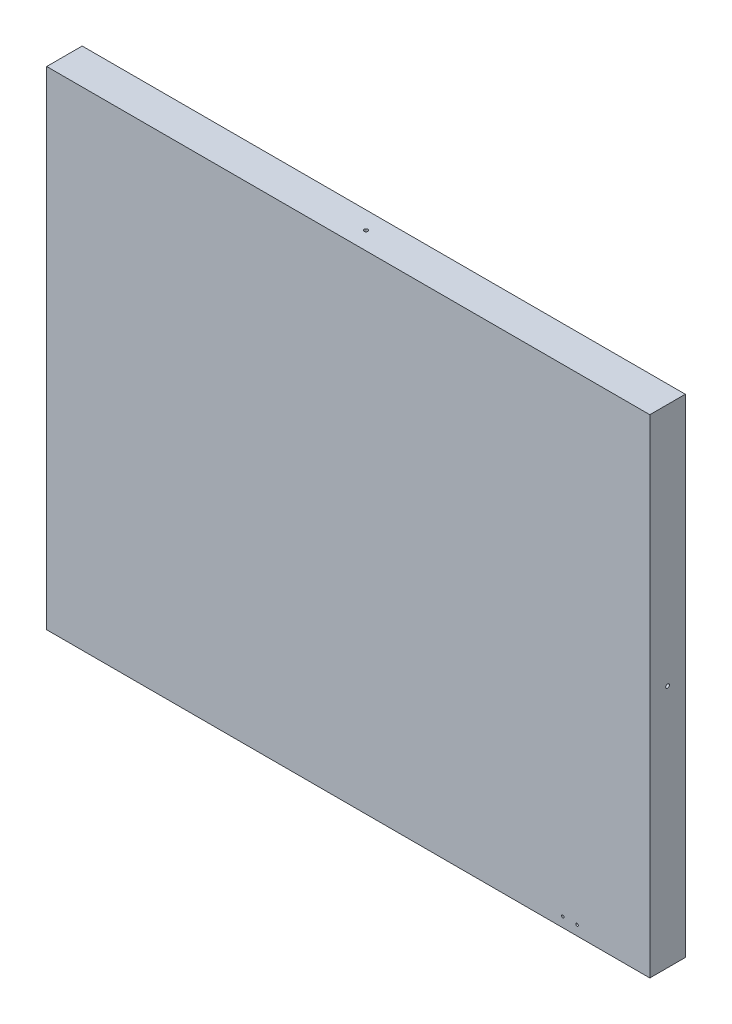
ISO-10303-21;
HEADER;
FILE_DESCRIPTION(('STEP AP214'),'2;1');
FILE_NAME('part.step','',(''),(''),'','','');
FILE_SCHEMA(('AUTOMOTIVE_DESIGN { 1 0 10303 214 1 1 1 1 }'));
ENDSEC;
DATA;
#1=APPLICATION_CONTEXT('core data for automotive mechanical design processes');
#2=APPLICATION_PROTOCOL_DEFINITION('international standard','automotive_design',2000,#1);
#3=PRODUCT_CONTEXT('',#1,'mechanical');
#4=PRODUCT('Part','Part','',(#3));
#5=PRODUCT_RELATED_PRODUCT_CATEGORY('part','',(#4));
#6=PRODUCT_DEFINITION_FORMATION('','',#4);
#7=PRODUCT_DEFINITION_CONTEXT('part definition',#1,'design');
#8=PRODUCT_DEFINITION('design','',#6,#7);
#9=PRODUCT_DEFINITION_SHAPE('','',#8);
#10=(LENGTH_UNIT() NAMED_UNIT(*) SI_UNIT(.MILLI.,.METRE.));
#11=(NAMED_UNIT(*) PLANE_ANGLE_UNIT() SI_UNIT($,.RADIAN.));
#12=(NAMED_UNIT(*) SI_UNIT($,.STERADIAN.) SOLID_ANGLE_UNIT());
#13=UNCERTAINTY_MEASURE_WITH_UNIT(LENGTH_MEASURE(1.E-05),#10,'distance_accuracy_value','');
#14=(GEOMETRIC_REPRESENTATION_CONTEXT(3) GLOBAL_UNCERTAINTY_ASSIGNED_CONTEXT((#13)) GLOBAL_UNIT_ASSIGNED_CONTEXT((#10,
#11,#12)) REPRESENTATION_CONTEXT('',''));
#15=CARTESIAN_POINT('',(0.,0.,0.));
#16=DIRECTION('',(0.,0.,1.));
#17=DIRECTION('',(1.,0.,0.));
#18=AXIS2_PLACEMENT_3D('',#15,#16,#17);
#19=CARTESIAN_POINT('',(0.,-275.,20.));
#20=DIRECTION('',(0.,-1.,0.));
#21=DIRECTION('',(0.,0.,-1.));
#22=AXIS2_PLACEMENT_3D('',#19,#20,#21);
#23=CYLINDRICAL_SURFACE('',#22,2.09999999999996);
#24=CARTESIAN_POINT('',(0.,-275.,20.));
#25=DIRECTION('',(0.,-1.,0.));
#26=DIRECTION('',(0.,0.,-1.));
#27=AXIS2_PLACEMENT_3D('',#24,#25,#26);
#28=CIRCLE('',#27,2.09999999999999);
#29=CARTESIAN_POINT('',(0.,-275.,17.9));
#30=VERTEX_POINT('',#29);
#31=EDGE_CURVE('E144',#30,#30,#28,.T.);
#32=ORIENTED_EDGE('',*,*,#31,.T.);
#33=EDGE_LOOP('',(#32));
#34=FACE_BOUND('',#33,.T.);
#35=CARTESIAN_POINT('',(0.,0.,20.));
#36=DIRECTION('',(0.707106781186547,-0.707106781186547,0.));
#37=DIRECTION('',(-0.707106781186547,-0.707106781186547,0.));
#38=AXIS2_PLACEMENT_3D('',#35,#36,#37);
#39=ELLIPSE('',#38,2.96984848098344,2.09999999999996);
#40=CARTESIAN_POINT('',(0.,0.,17.9));
#41=VERTEX_POINT('',#40);
#42=CARTESIAN_POINT('',(0.,0.,22.1));
#43=VERTEX_POINT('',#42);
#44=EDGE_CURVE('E69',#41,#43,#39,.F.);
#45=ORIENTED_EDGE('',*,*,#44,.T.);
#46=CARTESIAN_POINT('',(0.,0.,20.));
#47=DIRECTION('',(-0.707106781186547,-0.707106781186547,0.));
#48=DIRECTION('',(0.707106781186547,-0.707106781186547,0.));
#49=AXIS2_PLACEMENT_3D('',#46,#47,#48);
#50=ELLIPSE('',#49,2.96984848098344,2.09999999999996);
#51=EDGE_CURVE('E13',#43,#41,#50,.F.);
#52=ORIENTED_EDGE('',*,*,#51,.T.);
#53=EDGE_LOOP('',(#45,#52));
#54=FACE_BOUND('',#53,.T.);
#55=ADVANCED_FACE('F56',(#34,#54),#23,.F.);
#56=CARTESIAN_POINT('',(340.,275.,40.));
#57=DIRECTION('',(-1.,0.,0.));
#58=DIRECTION('',(0.,-1.,0.));
#59=AXIS2_PLACEMENT_3D('',#56,#57,#58);
#60=PLANE('',#59);
#61=CARTESIAN_POINT('',(340.,0.,20.));
#62=DIRECTION('',(-1.,0.,0.));
#63=DIRECTION('',(0.,0.,1.));
#64=AXIS2_PLACEMENT_3D('',#61,#62,#63);
#65=CIRCLE('',#64,2.09999999999992);
#66=CARTESIAN_POINT('',(340.,0.,22.0999999999999));
#67=VERTEX_POINT('',#66);
#68=EDGE_CURVE('E141',#67,#67,#65,.T.);
#69=ORIENTED_EDGE('',*,*,#68,.T.);
#70=EDGE_LOOP('',(#69));
#71=FACE_BOUND('',#70,.T.);
#72=DIRECTION('',(0.,1.,0.));
#73=VECTOR('',#72,1.);
#74=CARTESIAN_POINT('',(340.,275.,0.));
#75=LINE('',#74,#73);
#76=CARTESIAN_POINT('',(340.,-275.,0.));
#77=VERTEX_POINT('',#76);
#78=CARTESIAN_POINT('',(340.,275.,0.));
#79=VERTEX_POINT('',#78);
#80=EDGE_CURVE('E150',#77,#79,#75,.T.);
#81=ORIENTED_EDGE('',*,*,#80,.T.);
#82=DIRECTION('',(0.,0.,-1.));
#83=VECTOR('',#82,1.);
#84=CARTESIAN_POINT('',(340.,275.,40.));
#85=LINE('',#84,#83);
#86=CARTESIAN_POINT('',(340.,275.,40.));
#87=VERTEX_POINT('',#86);
#88=EDGE_CURVE('E171',#87,#79,#85,.T.);
#89=ORIENTED_EDGE('',*,*,#88,.F.);
#90=DIRECTION('',(0.,1.,0.));
#91=VECTOR('',#90,1.);
#92=CARTESIAN_POINT('',(340.,275.,40.));
#93=LINE('',#92,#91);
#94=CARTESIAN_POINT('',(340.,-275.,40.));
#95=VERTEX_POINT('',#94);
#96=EDGE_CURVE('E151',#95,#87,#93,.T.);
#97=ORIENTED_EDGE('',*,*,#96,.F.);
#98=DIRECTION('',(0.,0.,-1.));
#99=VECTOR('',#98,1.);
#100=CARTESIAN_POINT('',(340.,-275.,40.));
#101=LINE('',#100,#99);
#102=EDGE_CURVE('E157',#95,#77,#101,.T.);
#103=ORIENTED_EDGE('',*,*,#102,.T.);
#104=EDGE_LOOP('',(#81,#89,#97,#103));
#105=FACE_BOUND('',#104,.T.);
#106=ADVANCED_FACE('F58',(#71,#105),#60,.F.);
#107=CARTESIAN_POINT('',(-340.,275.,40.));
#108=DIRECTION('',(0.,-1.,0.));
#109=DIRECTION('',(0.,0.,-1.));
#110=AXIS2_PLACEMENT_3D('',#107,#108,#109);
#111=PLANE('',#110);
#112=CARTESIAN_POINT('',(0.,275.,20.));
#113=DIRECTION('',(0.,-1.,0.));
#114=DIRECTION('',(0.,0.,-1.));
#115=AXIS2_PLACEMENT_3D('',#112,#113,#114);
#116=CIRCLE('',#115,2.09999999999993);
#117=CARTESIAN_POINT('',(0.,275.,17.9000000000001));
#118=VERTEX_POINT('',#117);
#119=EDGE_CURVE('E147',#118,#118,#116,.T.);
#120=ORIENTED_EDGE('',*,*,#119,.T.);
#121=EDGE_LOOP('',(#120));
#122=FACE_BOUND('',#121,.T.);
#123=DIRECTION('',(-1.,0.,0.));
#124=VECTOR('',#123,1.);
#125=CARTESIAN_POINT('',(-340.,275.,0.));
#126=LINE('',#125,#124);
#127=CARTESIAN_POINT('',(-340.,275.,0.));
#128=VERTEX_POINT('',#127);
#129=EDGE_CURVE('E160',#79,#128,#126,.T.);
#130=ORIENTED_EDGE('',*,*,#129,.T.);
#131=DIRECTION('',(0.,0.,-1.));
#132=VECTOR('',#131,1.);
#133=CARTESIAN_POINT('',(-340.,275.,40.));
#134=LINE('',#133,#132);
#135=CARTESIAN_POINT('',(-340.,275.,40.));
#136=VERTEX_POINT('',#135);
#137=EDGE_CURVE('E168',#136,#128,#134,.T.);
#138=ORIENTED_EDGE('',*,*,#137,.F.);
#139=DIRECTION('',(-1.,0.,0.));
#140=VECTOR('',#139,1.);
#141=CARTESIAN_POINT('',(-340.,275.,40.));
#142=LINE('',#141,#140);
#143=EDGE_CURVE('E107',#87,#136,#142,.T.);
#144=ORIENTED_EDGE('',*,*,#143,.F.);
#145=ORIENTED_EDGE('',*,*,#88,.T.);
#146=EDGE_LOOP('',(#130,#138,#144,#145));
#147=FACE_BOUND('',#146,.T.);
#148=ADVANCED_FACE('F191',(#122,#147),#111,.F.);
#149=CARTESIAN_POINT('',(-340.,275.,40.));
#150=DIRECTION('',(1.,0.,0.));
#151=DIRECTION('',(0.,1.,0.));
#152=AXIS2_PLACEMENT_3D('',#149,#150,#151);
#153=PLANE('',#152);
#154=CARTESIAN_POINT('',(-340.,0.,20.));
#155=DIRECTION('',(-1.,0.,0.));
#156=DIRECTION('',(0.,0.,1.));
#157=AXIS2_PLACEMENT_3D('',#154,#155,#156);
#158=CIRCLE('',#157,2.09999999999999);
#159=CARTESIAN_POINT('',(-340.,0.,22.1));
#160=VERTEX_POINT('',#159);
#161=EDGE_CURVE('E138',#160,#160,#158,.T.);
#162=ORIENTED_EDGE('',*,*,#161,.F.);
#163=EDGE_LOOP('',(#162));
#164=FACE_BOUND('',#163,.T.);
#165=DIRECTION('',(0.,-1.,0.));
#166=VECTOR('',#165,1.);
#167=CARTESIAN_POINT('',(-340.,275.,0.));
#168=LINE('',#167,#166);
#169=CARTESIAN_POINT('',(-340.,-275.,0.));
#170=VERTEX_POINT('',#169);
#171=EDGE_CURVE('E162',#128,#170,#168,.T.);
#172=ORIENTED_EDGE('',*,*,#171,.T.);
#173=DIRECTION('',(0.,0.,-1.));
#174=VECTOR('',#173,1.);
#175=CARTESIAN_POINT('',(-340.,-275.,40.));
#176=LINE('',#175,#174);
#177=CARTESIAN_POINT('',(-340.,-275.,40.));
#178=VERTEX_POINT('',#177);
#179=EDGE_CURVE('E166',#178,#170,#176,.T.);
#180=ORIENTED_EDGE('',*,*,#179,.F.);
#181=DIRECTION('',(0.,-1.,0.));
#182=VECTOR('',#181,1.);
#183=CARTESIAN_POINT('',(-340.,275.,40.));
#184=LINE('',#183,#182);
#185=EDGE_CURVE('E154',#136,#178,#184,.T.);
#186=ORIENTED_EDGE('',*,*,#185,.F.);
#187=ORIENTED_EDGE('',*,*,#137,.T.);
#188=EDGE_LOOP('',(#172,#180,#186,#187));
#189=FACE_BOUND('',#188,.T.);
#190=ADVANCED_FACE('F214',(#164,#189),#153,.F.);
#191=CARTESIAN_POINT('',(-340.,-275.,40.));
#192=DIRECTION('',(0.,1.,0.));
#193=DIRECTION('',(0.,0.,1.));
#194=AXIS2_PLACEMENT_3D('',#191,#192,#193);
#195=PLANE('',#194);
#196=ORIENTED_EDGE('',*,*,#31,.F.);
#197=EDGE_LOOP('',(#196));
#198=FACE_BOUND('',#197,.T.);
#199=DIRECTION('',(1.,0.,0.));
#200=VECTOR('',#199,1.);
#201=CARTESIAN_POINT('',(-340.,-275.,0.));
#202=LINE('',#201,#200);
#203=EDGE_CURVE('E99',#170,#77,#202,.T.);
#204=ORIENTED_EDGE('',*,*,#203,.T.);
#205=ORIENTED_EDGE('',*,*,#102,.F.);
#206=DIRECTION('',(1.,0.,0.));
#207=VECTOR('',#206,1.);
#208=CARTESIAN_POINT('',(-340.,-275.,40.));
#209=LINE('',#208,#207);
#210=EDGE_CURVE('E78',#178,#95,#209,.T.);
#211=ORIENTED_EDGE('',*,*,#210,.F.);
#212=ORIENTED_EDGE('',*,*,#179,.T.);
#213=EDGE_LOOP('',(#204,#205,#211,#212));
#214=FACE_BOUND('',#213,.T.);
#215=ADVANCED_FACE('F208',(#198,#214),#195,.F.);
#216=CARTESIAN_POINT('',(0.,0.,40.));
#217=DIRECTION('',(0.,0.,1.));
#218=DIRECTION('',(1.,0.,0.));
#219=AXIS2_PLACEMENT_3D('',#216,#217,#218);
#220=PLANE('',#219);
#221=CARTESIAN_POINT('',(258.,-264.,40.));
#222=DIRECTION('',(0.,0.,1.));
#223=DIRECTION('',(1.,0.,0.));
#224=AXIS2_PLACEMENT_3D('',#221,#222,#223);
#225=CIRCLE('',#224,1.45000000000001);
#226=CARTESIAN_POINT('',(259.45,-264.,40.));
#227=VERTEX_POINT('',#226);
#228=EDGE_CURVE('E128',#227,#227,#225,.T.);
#229=ORIENTED_EDGE('',*,*,#228,.F.);
#230=EDGE_LOOP('',(#229));
#231=FACE_BOUND('',#230,.T.);
#232=CARTESIAN_POINT('',(242.,-264.,40.));
#233=DIRECTION('',(0.,0.,1.));
#234=DIRECTION('',(1.,0.,0.));
#235=AXIS2_PLACEMENT_3D('',#232,#233,#234);
#236=CIRCLE('',#235,1.44999999999998);
#237=CARTESIAN_POINT('',(243.45,-264.,40.));
#238=VERTEX_POINT('',#237);
#239=EDGE_CURVE('E127',#238,#238,#236,.T.);
#240=ORIENTED_EDGE('',*,*,#239,.F.);
#241=EDGE_LOOP('',(#240));
#242=FACE_BOUND('',#241,.T.);
#243=ORIENTED_EDGE('',*,*,#96,.T.);
#244=ORIENTED_EDGE('',*,*,#143,.T.);
#245=ORIENTED_EDGE('',*,*,#185,.T.);
#246=ORIENTED_EDGE('',*,*,#210,.T.);
#247=EDGE_LOOP('',(#243,#244,#245,#246));
#248=FACE_BOUND('',#247,.T.);
#249=ADVANCED_FACE('F202',(#231,#242,#248),#220,.T.);
#250=CARTESIAN_POINT('',(0.,0.,0.));
#251=DIRECTION('',(0.,0.,1.));
#252=DIRECTION('',(1.,0.,0.));
#253=AXIS2_PLACEMENT_3D('',#250,#251,#252);
#254=PLANE('',#253);
#255=ORIENTED_EDGE('',*,*,#80,.F.);
#256=ORIENTED_EDGE('',*,*,#203,.F.);
#257=ORIENTED_EDGE('',*,*,#171,.F.);
#258=ORIENTED_EDGE('',*,*,#129,.F.);
#259=EDGE_LOOP('',(#255,#256,#257,#258));
#260=FACE_BOUND('',#259,.T.);
#261=ADVANCED_FACE('F196',(#260),#254,.F.);
#262=CARTESIAN_POINT('',(0.,0.,20.));
#263=DIRECTION('',(0.707106781186547,-0.707106781186547,0.));
#264=DIRECTION('',(-0.707106781186547,-0.707106781186547,0.));
#265=AXIS2_PLACEMENT_3D('',#262,#263,#264);
#266=ELLIPSE('',#265,2.96984848098344,2.09999999999996);
#267=EDGE_CURVE('E174',#41,#43,#266,.T.);
#268=ORIENTED_EDGE('',*,*,#267,.T.);
#269=CARTESIAN_POINT('',(0.,0.,20.));
#270=DIRECTION('',(-0.707106781186547,-0.707106781186547,0.));
#271=DIRECTION('',(0.707106781186547,-0.707106781186547,0.));
#272=AXIS2_PLACEMENT_3D('',#269,#270,#271);
#273=ELLIPSE('',#272,2.96984848098344,2.09999999999996);
#274=EDGE_CURVE('E64',#43,#41,#273,.T.);
#275=ORIENTED_EDGE('',*,*,#274,.T.);
#276=EDGE_LOOP('',(#268,#275));
#277=FACE_BOUND('',#276,.T.);
#278=ORIENTED_EDGE('',*,*,#119,.F.);
#279=EDGE_LOOP('',(#278));
#280=FACE_BOUND('',#279,.T.);
#281=ADVANCED_FACE('F178',(#277,#280),#23,.F.);
#282=CARTESIAN_POINT('',(-340.,0.,20.));
#283=DIRECTION('',(-1.,0.,0.));
#284=DIRECTION('',(0.,0.,1.));
#285=AXIS2_PLACEMENT_3D('',#282,#283,#284);
#286=CYLINDRICAL_SURFACE('',#285,2.09999999999995);
#287=ORIENTED_EDGE('',*,*,#161,.T.);
#288=EDGE_LOOP('',(#287));
#289=FACE_BOUND('',#288,.T.);
#290=ORIENTED_EDGE('',*,*,#44,.F.);
#291=ORIENTED_EDGE('',*,*,#274,.F.);
#292=EDGE_LOOP('',(#290,#291));
#293=FACE_BOUND('',#292,.T.);
#294=ADVANCED_FACE('F182',(#289,#293),#286,.F.);
#295=ORIENTED_EDGE('',*,*,#68,.F.);
#296=EDGE_LOOP('',(#295));
#297=FACE_BOUND('',#296,.T.);
#298=ORIENTED_EDGE('',*,*,#267,.F.);
#299=ORIENTED_EDGE('',*,*,#51,.F.);
#300=EDGE_LOOP('',(#298,#299));
#301=FACE_BOUND('',#300,.T.);
#302=ADVANCED_FACE('F184',(#297,#301),#286,.F.);
#303=CARTESIAN_POINT('',(242.,-264.,35.));
#304=DIRECTION('',(0.,0.,1.));
#305=DIRECTION('',(1.,0.,0.));
#306=AXIS2_PLACEMENT_3D('',#303,#304,#305);
#307=CONICAL_SURFACE('',#306,1.45000000000001,1.02974425867666);
#308=CARTESIAN_POINT('',(242.,-264.,34.12875210241));
#309=VERTEX_POINT('',#308);
#310=VERTEX_LOOP('',#309);
#311=FACE_BOUND('',#310,.T.);
#312=CARTESIAN_POINT('',(242.,-264.,35.));
#313=DIRECTION('',(0.,0.,1.));
#314=DIRECTION('',(1.,0.,0.));
#315=AXIS2_PLACEMENT_3D('',#312,#313,#314);
#316=CIRCLE('',#315,1.45000000000001);
#317=CARTESIAN_POINT('',(243.45,-264.,35.));
#318=VERTEX_POINT('',#317);
#319=EDGE_CURVE('E131',#318,#318,#316,.T.);
#320=ORIENTED_EDGE('',*,*,#319,.T.);
#321=EDGE_LOOP('',(#320));
#322=FACE_BOUND('',#321,.T.);
#323=ADVANCED_FACE('F259',(#311,#322),#307,.F.);
#324=CARTESIAN_POINT('',(242.,-264.,40.));
#325=DIRECTION('',(0.,0.,1.));
#326=DIRECTION('',(1.,0.,0.));
#327=AXIS2_PLACEMENT_3D('',#324,#325,#326);
#328=CYLINDRICAL_SURFACE('',#327,1.44999999999999);
#329=ORIENTED_EDGE('',*,*,#319,.F.);
#330=EDGE_LOOP('',(#329));
#331=FACE_BOUND('',#330,.T.);
#332=ORIENTED_EDGE('',*,*,#239,.T.);
#333=EDGE_LOOP('',(#332));
#334=FACE_BOUND('',#333,.T.);
#335=ADVANCED_FACE('F121',(#331,#334),#328,.F.);
#336=CARTESIAN_POINT('',(258.,-264.,35.));
#337=DIRECTION('',(0.,0.,1.));
#338=DIRECTION('',(1.,0.,0.));
#339=AXIS2_PLACEMENT_3D('',#336,#337,#338);
#340=CONICAL_SURFACE('',#339,1.45000000000001,1.02974425867666);
#341=CARTESIAN_POINT('',(258.,-264.,34.12875210241));
#342=VERTEX_POINT('',#341);
#343=VERTEX_LOOP('',#342);
#344=FACE_BOUND('',#343,.T.);
#345=CARTESIAN_POINT('',(258.,-264.,35.));
#346=DIRECTION('',(0.,0.,1.));
#347=DIRECTION('',(1.,0.,0.));
#348=AXIS2_PLACEMENT_3D('',#345,#346,#347);
#349=CIRCLE('',#348,1.45000000000001);
#350=CARTESIAN_POINT('',(259.45,-264.,35.));
#351=VERTEX_POINT('',#350);
#352=EDGE_CURVE('E125',#351,#351,#349,.T.);
#353=ORIENTED_EDGE('',*,*,#352,.T.);
#354=EDGE_LOOP('',(#353));
#355=FACE_BOUND('',#354,.T.);
#356=ADVANCED_FACE('F117',(#344,#355),#340,.F.);
#357=CARTESIAN_POINT('',(258.,-264.,40.));
#358=DIRECTION('',(0.,0.,1.));
#359=DIRECTION('',(1.,0.,0.));
#360=AXIS2_PLACEMENT_3D('',#357,#358,#359);
#361=CYLINDRICAL_SURFACE('',#360,1.45000000000001);
#362=ORIENTED_EDGE('',*,*,#352,.F.);
#363=EDGE_LOOP('',(#362));
#364=FACE_BOUND('',#363,.T.);
#365=ORIENTED_EDGE('',*,*,#228,.T.);
#366=EDGE_LOOP('',(#365));
#367=FACE_BOUND('',#366,.T.);
#368=ADVANCED_FACE('F120',(#364,#367),#361,.F.);
#369=CLOSED_SHELL('',(#55,#106,#148,#190,#215,#249,#261,#281,#294,#302,#323,#335,#356,#368));
#370=MANIFOLD_SOLID_BREP('B2',#369);
#371=ADVANCED_BREP_SHAPE_REPRESENTATION('',(#18,#370),#14);
#372=SHAPE_DEFINITION_REPRESENTATION(#9,#371);
ENDSEC;
END-ISO-10303-21;
